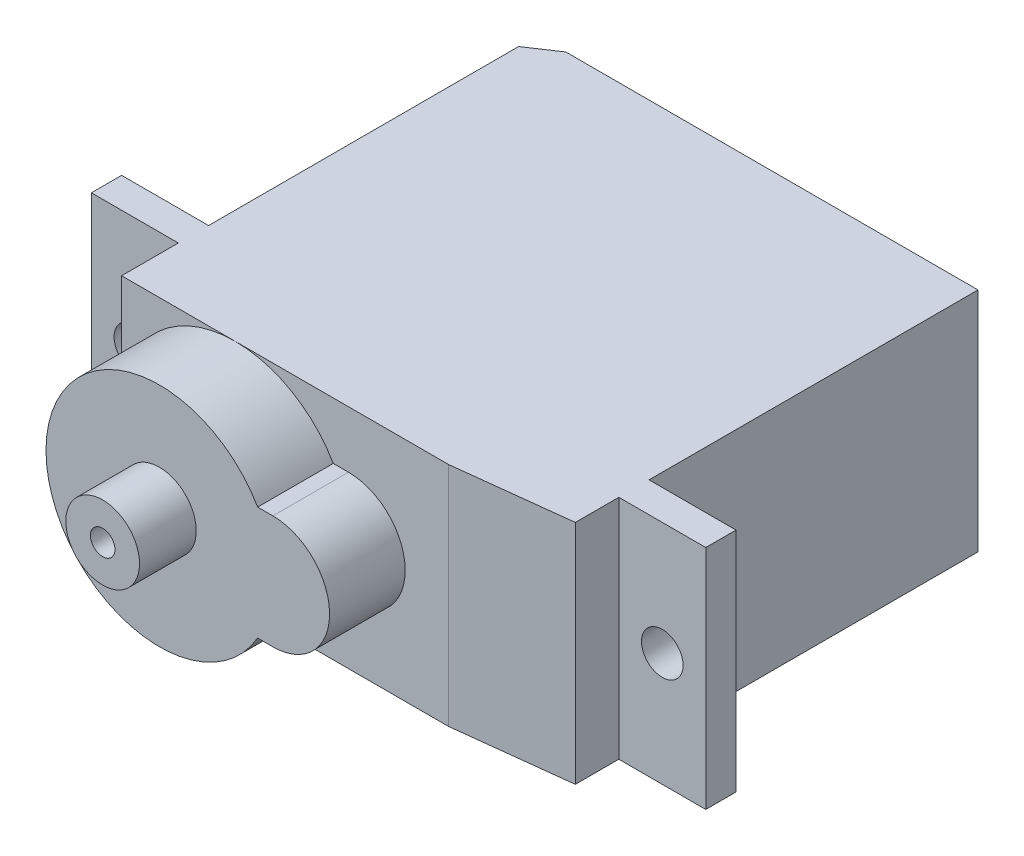
ISO-10303-21;
HEADER;
FILE_DESCRIPTION(('STEP AP214'),'2;1');
FILE_NAME('part.step','',(''),(''),'','','');
FILE_SCHEMA(('AUTOMOTIVE_DESIGN { 1 0 10303 214 1 1 1 1 }'));
ENDSEC;
DATA;
#1=APPLICATION_CONTEXT('core data for automotive mechanical design processes');
#2=APPLICATION_PROTOCOL_DEFINITION('international standard','automotive_design',2000,#1);
#3=PRODUCT_CONTEXT('',#1,'mechanical');
#4=PRODUCT('Part','Part','',(#3));
#5=PRODUCT_RELATED_PRODUCT_CATEGORY('part','',(#4));
#6=PRODUCT_DEFINITION_FORMATION('','',#4);
#7=PRODUCT_DEFINITION_CONTEXT('part definition',#1,'design');
#8=PRODUCT_DEFINITION('design','',#6,#7);
#9=PRODUCT_DEFINITION_SHAPE('','',#8);
#10=(LENGTH_UNIT() NAMED_UNIT(*) SI_UNIT(.MILLI.,.METRE.));
#11=(NAMED_UNIT(*) PLANE_ANGLE_UNIT() SI_UNIT($,.RADIAN.));
#12=(NAMED_UNIT(*) SI_UNIT($,.STERADIAN.) SOLID_ANGLE_UNIT());
#13=UNCERTAINTY_MEASURE_WITH_UNIT(LENGTH_MEASURE(1.E-05),#10,'distance_accuracy_value','');
#14=(GEOMETRIC_REPRESENTATION_CONTEXT(3) GLOBAL_UNCERTAINTY_ASSIGNED_CONTEXT((#13)) GLOBAL_UNIT_ASSIGNED_CONTEXT((#10,
#11,#12)) REPRESENTATION_CONTEXT('',''));
#15=CARTESIAN_POINT('',(0.,0.,0.));
#16=DIRECTION('',(0.,0.,1.));
#17=DIRECTION('',(1.,0.,0.));
#18=AXIS2_PLACEMENT_3D('',#15,#16,#17);
#19=CARTESIAN_POINT('',(7.52282644514605,-5.99999999999992,26.));
#20=DIRECTION('',(0.,0.,1.));
#21=DIRECTION('',(1.,0.,0.));
#22=AXIS2_PLACEMENT_3D('',#19,#20,#21);
#23=PLANE('',#22);
#24=CARTESIAN_POINT('',(5.99715287672404,-5.72034978216512,26.));
#25=DIRECTION('',(0.,0.,1.));
#26=DIRECTION('',(1.,0.,0.));
#27=AXIS2_PLACEMENT_3D('',#24,#25,#26);
#28=CIRCLE('',#27,0.649999999999999);
#29=CARTESIAN_POINT('',(6.64715287672404,-5.72034978216512,26.));
#30=VERTEX_POINT('',#29);
#31=EDGE_CURVE('E18',#30,#30,#28,.T.);
#32=ORIENTED_EDGE('',*,*,#31,.T.);
#33=EDGE_LOOP('',(#32));
#34=FACE_BOUND('',#33,.T.);
#35=ADVANCED_FACE('F15',(#34),#23,.T.);
#36=CARTESIAN_POINT('',(5.99715287672404,-5.72034978216512,26.));
#37=DIRECTION('',(0.,0.,1.));
#38=DIRECTION('',(1.,0.,0.));
#39=AXIS2_PLACEMENT_3D('',#36,#37,#38);
#40=CYLINDRICAL_SURFACE('',#39,0.649999999999999);
#41=ORIENTED_EDGE('',*,*,#31,.F.);
#42=EDGE_LOOP('',(#41));
#43=FACE_BOUND('',#42,.T.);
#44=CARTESIAN_POINT('',(5.99715287672404,-5.72034978216512,29.));
#45=DIRECTION('',(0.,0.,1.));
#46=DIRECTION('',(1.,0.,0.));
#47=AXIS2_PLACEMENT_3D('',#44,#45,#46);
#48=CIRCLE('',#47,0.649999999999999);
#49=CARTESIAN_POINT('',(6.64715287672404,-5.72034978216512,29.));
#50=VERTEX_POINT('',#49);
#51=EDGE_CURVE('E247',#50,#50,#48,.F.);
#52=ORIENTED_EDGE('',*,*,#51,.F.);
#53=EDGE_LOOP('',(#52));
#54=FACE_BOUND('',#53,.T.);
#55=ADVANCED_FACE('F255',(#43,#54),#40,.F.);
#56=CARTESIAN_POINT('',(5.99715287672404,-5.72034978216512,29.));
#57=DIRECTION('',(0.,0.,1.));
#58=DIRECTION('',(1.,0.,0.));
#59=AXIS2_PLACEMENT_3D('',#56,#57,#58);
#60=PLANE('',#59);
#61=CARTESIAN_POINT('',(5.99715287672404,-5.72034978216512,29.));
#62=DIRECTION('',(0.,0.,1.));
#63=DIRECTION('',(1.,0.,0.));
#64=AXIS2_PLACEMENT_3D('',#61,#62,#63);
#65=CIRCLE('',#64,1.95);
#66=CARTESIAN_POINT('',(7.94715287672404,-5.72034978216512,29.));
#67=VERTEX_POINT('',#66);
#68=EDGE_CURVE('E245',#67,#67,#65,.F.);
#69=ORIENTED_EDGE('',*,*,#68,.F.);
#70=EDGE_LOOP('',(#69));
#71=FACE_BOUND('',#70,.T.);
#72=ORIENTED_EDGE('',*,*,#51,.T.);
#73=EDGE_LOOP('',(#72));
#74=FACE_BOUND('',#73,.T.);
#75=ADVANCED_FACE('F258',(#71,#74),#60,.T.);
#76=CARTESIAN_POINT('',(5.99715287672404,-5.72034978216512,26.));
#77=DIRECTION('',(0.,0.,1.));
#78=DIRECTION('',(1.,0.,0.));
#79=AXIS2_PLACEMENT_3D('',#76,#77,#78);
#80=CYLINDRICAL_SURFACE('',#79,1.95);
#81=CARTESIAN_POINT('',(5.99715287672404,-5.72034978216512,26.));
#82=DIRECTION('',(0.,0.,1.));
#83=DIRECTION('',(1.,0.,0.));
#84=AXIS2_PLACEMENT_3D('',#81,#82,#83);
#85=CIRCLE('',#84,1.95);
#86=CARTESIAN_POINT('',(7.94715287672404,-5.72034978216512,26.));
#87=VERTEX_POINT('',#86);
#88=EDGE_CURVE('E241',#87,#87,#85,.F.);
#89=ORIENTED_EDGE('',*,*,#88,.F.);
#90=EDGE_LOOP('',(#89));
#91=FACE_BOUND('',#90,.T.);
#92=ORIENTED_EDGE('',*,*,#68,.T.);
#93=EDGE_LOOP('',(#92));
#94=FACE_BOUND('',#93,.T.);
#95=ADVANCED_FACE('F263',(#91,#94),#80,.T.);
#96=CARTESIAN_POINT('',(-3.5,-6.,0.999999999999998));
#97=DIRECTION('',(-1.,0.,0.));
#98=DIRECTION('',(0.,0.,1.));
#99=AXIS2_PLACEMENT_3D('',#96,#97,#98);
#100=PLANE('',#99);
#101=CARTESIAN_POINT('',(-3.5,-6.,0.999999999999998));
#102=DIRECTION('',(1.,0.,0.));
#103=DIRECTION('',(0.,0.,-1.));
#104=AXIS2_PLACEMENT_3D('',#101,#102,#103);
#105=CIRCLE('',#104,0.5);
#106=CARTESIAN_POINT('',(-3.5,-6.,0.499999999999998));
#107=VERTEX_POINT('',#106);
#108=EDGE_CURVE('E238',#107,#107,#105,.T.);
#109=ORIENTED_EDGE('',*,*,#108,.F.);
#110=EDGE_LOOP('',(#109));
#111=FACE_BOUND('',#110,.T.);
#112=ADVANCED_FACE('F382',(#111),#100,.T.);
#113=CARTESIAN_POINT('',(-3.5,-7.05,0.999999999999994));
#114=DIRECTION('',(-1.,0.,0.));
#115=DIRECTION('',(0.,0.,1.));
#116=AXIS2_PLACEMENT_3D('',#113,#114,#115);
#117=PLANE('',#116);
#118=CARTESIAN_POINT('',(-3.5,-7.05,0.999999999999994));
#119=DIRECTION('',(1.,0.,0.));
#120=DIRECTION('',(0.,0.,-1.));
#121=AXIS2_PLACEMENT_3D('',#118,#119,#120);
#122=CIRCLE('',#121,0.5);
#123=CARTESIAN_POINT('',(-3.5,-7.05,0.499999999999994));
#124=VERTEX_POINT('',#123);
#125=EDGE_CURVE('E234',#124,#124,#122,.T.);
#126=ORIENTED_EDGE('',*,*,#125,.F.);
#127=EDGE_LOOP('',(#126));
#128=FACE_BOUND('',#127,.T.);
#129=ADVANCED_FACE('F378',(#128),#117,.T.);
#130=CARTESIAN_POINT('',(-3.5,-4.95,0.999999999999994));
#131=DIRECTION('',(-1.,0.,0.));
#132=DIRECTION('',(0.,0.,1.));
#133=AXIS2_PLACEMENT_3D('',#130,#131,#132);
#134=PLANE('',#133);
#135=CARTESIAN_POINT('',(-3.5,-4.95,0.999999999999994));
#136=DIRECTION('',(1.,0.,0.));
#137=DIRECTION('',(0.,0.,-1.));
#138=AXIS2_PLACEMENT_3D('',#135,#136,#137);
#139=CIRCLE('',#138,0.5);
#140=CARTESIAN_POINT('',(-3.5,-4.95,0.499999999999994));
#141=VERTEX_POINT('',#140);
#142=EDGE_CURVE('E229',#141,#141,#139,.T.);
#143=ORIENTED_EDGE('',*,*,#142,.F.);
#144=EDGE_LOOP('',(#143));
#145=FACE_BOUND('',#144,.T.);
#146=ADVANCED_FACE('F374',(#145),#134,.T.);
#147=CARTESIAN_POINT('',(7.52282644514605,-5.99999999999992,26.));
#148=DIRECTION('',(0.,0.,1.));
#149=DIRECTION('',(1.,0.,0.));
#150=AXIS2_PLACEMENT_3D('',#147,#148,#149);
#151=PLANE('',#150);
#152=CARTESIAN_POINT('',(12.0000004768372,-6.00000000000003,26.));
#153=DIRECTION('',(0.,0.,1.));
#154=DIRECTION('',(1.,0.,0.));
#155=AXIS2_PLACEMENT_3D('',#152,#153,#154);
#156=CIRCLE('',#155,2.99999999999999);
#157=CARTESIAN_POINT('',(12.0000004768373,-3.00000000000004,26.));
#158=VERTEX_POINT('',#157);
#159=CARTESIAN_POINT('',(12.0000004768372,-9.00000000000002,26.));
#160=VERTEX_POINT('',#159);
#161=EDGE_CURVE('E170',#158,#160,#156,.F.);
#162=ORIENTED_EDGE('',*,*,#161,.F.);
#163=DIRECTION('',(-1.,0.,0.));
#164=VECTOR('',#163,1.);
#165=CARTESIAN_POINT('',(11.5980764497721,-3.00000000000003,26.));
#166=LINE('',#165,#164);
#167=CARTESIAN_POINT('',(11.1961524227068,-3.00000000000002,26.));
#168=VERTEX_POINT('',#167);
#169=EDGE_CURVE('E244',#168,#158,#166,.F.);
#170=ORIENTED_EDGE('',*,*,#169,.F.);
#171=CARTESIAN_POINT('',(6.00000000000009,-5.99999999999988,26.));
#172=DIRECTION('',(0.,0.,1.));
#173=DIRECTION('',(1.,0.,0.));
#174=AXIS2_PLACEMENT_3D('',#171,#172,#173);
#175=CIRCLE('',#174,5.99999999999998);
#176=CARTESIAN_POINT('',(11.1961524227066,-9.00000000000001,26.));
#177=VERTEX_POINT('',#176);
#178=EDGE_CURVE('E222',#177,#168,#175,.F.);
#179=ORIENTED_EDGE('',*,*,#178,.F.);
#180=DIRECTION('',(1.,0.,0.));
#181=VECTOR('',#180,1.);
#182=CARTESIAN_POINT('',(11.5980764497719,-9.00000000000001,26.));
#183=LINE('',#182,#181);
#184=EDGE_CURVE('E163',#160,#177,#183,.F.);
#185=ORIENTED_EDGE('',*,*,#184,.F.);
#186=EDGE_LOOP('',(#162,#170,#179,#185));
#187=FACE_BOUND('',#186,.T.);
#188=ORIENTED_EDGE('',*,*,#88,.T.);
#189=EDGE_LOOP('',(#188));
#190=FACE_BOUND('',#189,.T.);
#191=ADVANCED_FACE('F370',(#187,#190),#151,.T.);
#192=CARTESIAN_POINT('',(11.5980764497721,-3.00000000000003,22.));
#193=DIRECTION('',(0.,1.,0.));
#194=DIRECTION('',(-1.,0.,0.));
#195=AXIS2_PLACEMENT_3D('',#192,#193,#194);
#196=PLANE('',#195);
#197=DIRECTION('',(-1.,0.,0.));
#198=VECTOR('',#197,1.);
#199=CARTESIAN_POINT('',(11.5980764497721,-3.00000000000003,22.));
#200=LINE('',#199,#198);
#201=CARTESIAN_POINT('',(12.0000004768373,-3.00000000000004,22.));
#202=VERTEX_POINT('',#201);
#203=CARTESIAN_POINT('',(11.1961524227068,-3.00000000000002,22.));
#204=VERTEX_POINT('',#203);
#205=EDGE_CURVE('E175',#202,#204,#200,.T.);
#206=ORIENTED_EDGE('',*,*,#205,.T.);
#207=DIRECTION('',(0.,0.,1.));
#208=VECTOR('',#207,1.);
#209=CARTESIAN_POINT('',(11.1961524227068,-3.00000000000003,22.));
#210=LINE('',#209,#208);
#211=EDGE_CURVE('E221',#168,#204,#210,.F.);
#212=ORIENTED_EDGE('',*,*,#211,.F.);
#213=ORIENTED_EDGE('',*,*,#169,.T.);
#214=DIRECTION('',(0.,0.,1.));
#215=VECTOR('',#214,1.);
#216=CARTESIAN_POINT('',(12.0000004768373,-3.00000000000004,22.));
#217=LINE('',#216,#215);
#218=EDGE_CURVE('E171',#202,#158,#217,.T.);
#219=ORIENTED_EDGE('',*,*,#218,.F.);
#220=EDGE_LOOP('',(#206,#212,#213,#219));
#221=FACE_BOUND('',#220,.T.);
#222=ADVANCED_FACE('F367',(#221),#196,.T.);
#223=CARTESIAN_POINT('',(11.5980764497719,-9.00000000000001,22.));
#224=DIRECTION('',(0.,-1.,0.));
#225=DIRECTION('',(1.,0.,0.));
#226=AXIS2_PLACEMENT_3D('',#223,#224,#225);
#227=PLANE('',#226);
#228=DIRECTION('',(1.,0.,0.));
#229=VECTOR('',#228,1.);
#230=CARTESIAN_POINT('',(11.5980764497719,-9.00000000000001,22.));
#231=LINE('',#230,#229);
#232=CARTESIAN_POINT('',(11.1961524227066,-9.00000000000001,22.));
#233=VERTEX_POINT('',#232);
#234=CARTESIAN_POINT('',(12.0000004768372,-9.00000000000002,22.));
#235=VERTEX_POINT('',#234);
#236=EDGE_CURVE('E150',#233,#235,#231,.T.);
#237=ORIENTED_EDGE('',*,*,#236,.T.);
#238=DIRECTION('',(0.,0.,1.));
#239=VECTOR('',#238,1.);
#240=CARTESIAN_POINT('',(12.0000004768372,-9.00000000000002,22.));
#241=LINE('',#240,#239);
#242=EDGE_CURVE('E154',#160,#235,#241,.F.);
#243=ORIENTED_EDGE('',*,*,#242,.F.);
#244=ORIENTED_EDGE('',*,*,#184,.T.);
#245=DIRECTION('',(0.,0.,1.));
#246=VECTOR('',#245,1.);
#247=CARTESIAN_POINT('',(11.1961524227066,-9.00000000000002,22.));
#248=LINE('',#247,#246);
#249=EDGE_CURVE('E157',#233,#177,#248,.T.);
#250=ORIENTED_EDGE('',*,*,#249,.F.);
#251=EDGE_LOOP('',(#237,#243,#244,#250));
#252=FACE_BOUND('',#251,.T.);
#253=ADVANCED_FACE('F152',(#252),#227,.T.);
#254=CARTESIAN_POINT('',(27.9,-6.,17.4));
#255=DIRECTION('',(1.,0.,0.));
#256=DIRECTION('',(0.,0.,-1.));
#257=AXIS2_PLACEMENT_3D('',#254,#255,#256);
#258=PLANE('',#257);
#259=DIRECTION('',(0.,-1.,0.));
#260=VECTOR('',#259,1.);
#261=CARTESIAN_POINT('',(27.9,-5.99999999999999,17.4));
#262=LINE('',#261,#260);
#263=CARTESIAN_POINT('',(27.9,-12.,17.4));
#264=VERTEX_POINT('',#263);
#265=CARTESIAN_POINT('',(27.9,0.,17.4));
#266=VERTEX_POINT('',#265);
#267=EDGE_CURVE('E212',#264,#266,#262,.F.);
#268=ORIENTED_EDGE('',*,*,#267,.T.);
#269=DIRECTION('',(0.,0.,-1.));
#270=VECTOR('',#269,1.);
#271=CARTESIAN_POINT('',(27.9,0.,17.4));
#272=LINE('',#271,#270);
#273=CARTESIAN_POINT('',(27.9,0.,19.));
#274=VERTEX_POINT('',#273);
#275=EDGE_CURVE('E162',#266,#274,#272,.F.);
#276=ORIENTED_EDGE('',*,*,#275,.T.);
#277=DIRECTION('',(0.,-1.,0.));
#278=VECTOR('',#277,1.);
#279=CARTESIAN_POINT('',(27.9,-5.99999999999999,19.));
#280=LINE('',#279,#278);
#281=CARTESIAN_POINT('',(27.9,-12.,19.));
#282=VERTEX_POINT('',#281);
#283=EDGE_CURVE('E217',#282,#274,#280,.F.);
#284=ORIENTED_EDGE('',*,*,#283,.F.);
#285=DIRECTION('',(0.,0.,1.));
#286=VECTOR('',#285,1.);
#287=CARTESIAN_POINT('',(27.9,-12.,0.));
#288=LINE('',#287,#286);
#289=EDGE_CURVE('E640',#264,#282,#288,.T.);
#290=ORIENTED_EDGE('',*,*,#289,.F.);
#291=EDGE_LOOP('',(#268,#276,#284,#290));
#292=FACE_BOUND('',#291,.T.);
#293=ADVANCED_FACE('F360',(#292),#258,.T.);
#294=CARTESIAN_POINT('',(25.6,-6.,17.4));
#295=DIRECTION('',(0.,0.,1.));
#296=DIRECTION('',(1.,0.,0.));
#297=AXIS2_PLACEMENT_3D('',#294,#295,#296);
#298=CYLINDRICAL_SURFACE('',#297,1.1);
#299=CARTESIAN_POINT('',(25.6,-6.,17.4));
#300=DIRECTION('',(0.,0.,1.));
#301=DIRECTION('',(1.,0.,0.));
#302=AXIS2_PLACEMENT_3D('',#299,#300,#301);
#303=CIRCLE('',#302,1.1);
#304=CARTESIAN_POINT('',(26.7,-6.,17.4));
#305=VERTEX_POINT('',#304);
#306=EDGE_CURVE('E208',#305,#305,#303,.F.);
#307=ORIENTED_EDGE('',*,*,#306,.T.);
#308=EDGE_LOOP('',(#307));
#309=FACE_BOUND('',#308,.T.);
#310=CARTESIAN_POINT('',(25.6,-6.,19.));
#311=DIRECTION('',(0.,0.,1.));
#312=DIRECTION('',(1.,0.,0.));
#313=AXIS2_PLACEMENT_3D('',#310,#311,#312);
#314=CIRCLE('',#313,1.1);
#315=CARTESIAN_POINT('',(26.7,-6.,19.));
#316=VERTEX_POINT('',#315);
#317=EDGE_CURVE('E213',#316,#316,#314,.F.);
#318=ORIENTED_EDGE('',*,*,#317,.F.);
#319=EDGE_LOOP('',(#318));
#320=FACE_BOUND('',#319,.T.);
#321=ADVANCED_FACE('F357',(#309,#320),#298,.F.);
#322=CARTESIAN_POINT('',(0.,-6.,0.999999999999998));
#323=DIRECTION('',(1.,0.,0.));
#324=DIRECTION('',(0.,0.,-1.));
#325=AXIS2_PLACEMENT_3D('',#322,#323,#324);
#326=CYLINDRICAL_SURFACE('',#325,0.5);
#327=CARTESIAN_POINT('',(0.,-6.,0.999999999999998));
#328=DIRECTION('',(0.554700196225228,0.,0.832050294337844));
#329=DIRECTION('',(0.832050294337844,0.,-0.554700196225228));
#330=AXIS2_PLACEMENT_3D('',#327,#328,#329);
#331=ELLIPSE('',#330,0.901387818865999,0.5);
#332=CARTESIAN_POINT('',(0.,-5.5,0.999999999999998));
#333=VERTEX_POINT('',#332);
#334=CARTESIAN_POINT('',(0.,-6.5,0.999999999999998));
#335=VERTEX_POINT('',#334);
#336=EDGE_CURVE('E205',#333,#335,#331,.F.);
#337=ORIENTED_EDGE('',*,*,#336,.T.);
#338=CARTESIAN_POINT('',(0.,-6.,0.999999999999998));
#339=DIRECTION('',(1.,0.,0.));
#340=DIRECTION('',(0.,0.,-1.));
#341=AXIS2_PLACEMENT_3D('',#338,#339,#340);
#342=CIRCLE('',#341,0.5);
#343=EDGE_CURVE('E84',#335,#333,#342,.F.);
#344=ORIENTED_EDGE('',*,*,#343,.T.);
#345=EDGE_LOOP('',(#337,#344));
#346=FACE_BOUND('',#345,.T.);
#347=ORIENTED_EDGE('',*,*,#108,.T.);
#348=EDGE_LOOP('',(#347));
#349=FACE_BOUND('',#348,.T.);
#350=ADVANCED_FACE('F353',(#346,#349),#326,.T.);
#351=CARTESIAN_POINT('',(0.,-7.05,0.999999999999994));
#352=DIRECTION('',(1.,0.,0.));
#353=DIRECTION('',(0.,0.,-1.));
#354=AXIS2_PLACEMENT_3D('',#351,#352,#353);
#355=CYLINDRICAL_SURFACE('',#354,0.5);
#356=CARTESIAN_POINT('',(0.,-7.05,0.999999999999994));
#357=DIRECTION('',(0.554700196225228,0.,0.832050294337844));
#358=DIRECTION('',(0.832050294337844,0.,-0.554700196225228));
#359=AXIS2_PLACEMENT_3D('',#356,#357,#358);
#360=ELLIPSE('',#359,0.901387818865999,0.5);
#361=CARTESIAN_POINT('',(0.,-6.55,0.999999999999998));
#362=VERTEX_POINT('',#361);
#363=CARTESIAN_POINT('',(0.,-7.55,0.999999999999998));
#364=VERTEX_POINT('',#363);
#365=EDGE_CURVE('E202',#362,#364,#360,.F.);
#366=ORIENTED_EDGE('',*,*,#365,.T.);
#367=CARTESIAN_POINT('',(0.,-7.05,0.999999999999994));
#368=DIRECTION('',(1.,0.,0.));
#369=DIRECTION('',(0.,0.,-1.));
#370=AXIS2_PLACEMENT_3D('',#367,#368,#369);
#371=CIRCLE('',#370,0.5);
#372=EDGE_CURVE('E232',#364,#362,#371,.F.);
#373=ORIENTED_EDGE('',*,*,#372,.T.);
#374=EDGE_LOOP('',(#366,#373));
#375=FACE_BOUND('',#374,.T.);
#376=ORIENTED_EDGE('',*,*,#125,.T.);
#377=EDGE_LOOP('',(#376));
#378=FACE_BOUND('',#377,.T.);
#379=ADVANCED_FACE('F349',(#375,#378),#355,.T.);
#380=CARTESIAN_POINT('',(0.,-4.95,0.999999999999994));
#381=DIRECTION('',(1.,0.,0.));
#382=DIRECTION('',(0.,0.,-1.));
#383=AXIS2_PLACEMENT_3D('',#380,#381,#382);
#384=CYLINDRICAL_SURFACE('',#383,0.5);
#385=CARTESIAN_POINT('',(0.,-4.95,0.999999999999994));
#386=DIRECTION('',(0.554700196225228,0.,0.832050294337844));
#387=DIRECTION('',(0.832050294337844,0.,-0.554700196225228));
#388=AXIS2_PLACEMENT_3D('',#385,#386,#387);
#389=ELLIPSE('',#388,0.901387818865999,0.5);
#390=CARTESIAN_POINT('',(0.,-4.45,0.999999999999999));
#391=VERTEX_POINT('',#390);
#392=CARTESIAN_POINT('',(0.,-5.45,0.999999999999998));
#393=VERTEX_POINT('',#392);
#394=EDGE_CURVE('E197',#391,#393,#389,.F.);
#395=ORIENTED_EDGE('',*,*,#394,.T.);
#396=CARTESIAN_POINT('',(0.,-4.95,0.999999999999994));
#397=DIRECTION('',(1.,0.,0.));
#398=DIRECTION('',(0.,0.,-1.));
#399=AXIS2_PLACEMENT_3D('',#396,#397,#398);
#400=CIRCLE('',#399,0.5);
#401=EDGE_CURVE('E227',#393,#391,#400,.F.);
#402=ORIENTED_EDGE('',*,*,#401,.T.);
#403=EDGE_LOOP('',(#395,#402));
#404=FACE_BOUND('',#403,.T.);
#405=ORIENTED_EDGE('',*,*,#142,.T.);
#406=EDGE_LOOP('',(#405));
#407=FACE_BOUND('',#406,.T.);
#408=ADVANCED_FACE('F345',(#404,#407),#384,.T.);
#409=CARTESIAN_POINT('',(-2.29999999999998,-5.99999999999999,17.4));
#410=DIRECTION('',(0.,0.,1.));
#411=DIRECTION('',(1.,0.,0.));
#412=AXIS2_PLACEMENT_3D('',#409,#410,#411);
#413=CYLINDRICAL_SURFACE('',#412,1.1);
#414=CARTESIAN_POINT('',(-2.29999999999998,-5.99999999999999,17.4));
#415=DIRECTION('',(0.,0.,1.));
#416=DIRECTION('',(1.,0.,0.));
#417=AXIS2_PLACEMENT_3D('',#414,#415,#416);
#418=CIRCLE('',#417,1.1);
#419=CARTESIAN_POINT('',(-1.19999999999998,-5.99999999999999,17.4));
#420=VERTEX_POINT('',#419);
#421=EDGE_CURVE('E193',#420,#420,#418,.F.);
#422=ORIENTED_EDGE('',*,*,#421,.T.);
#423=EDGE_LOOP('',(#422));
#424=FACE_BOUND('',#423,.T.);
#425=CARTESIAN_POINT('',(-2.29999999999998,-5.99999999999999,19.));
#426=DIRECTION('',(0.,0.,1.));
#427=DIRECTION('',(1.,0.,0.));
#428=AXIS2_PLACEMENT_3D('',#425,#426,#427);
#429=CIRCLE('',#428,1.1);
#430=CARTESIAN_POINT('',(-1.19999999999998,-5.99999999999999,19.));
#431=VERTEX_POINT('',#430);
#432=EDGE_CURVE('E189',#431,#431,#429,.F.);
#433=ORIENTED_EDGE('',*,*,#432,.F.);
#434=EDGE_LOOP('',(#433));
#435=FACE_BOUND('',#434,.T.);
#436=ADVANCED_FACE('F341',(#424,#435),#413,.F.);
#437=CARTESIAN_POINT('',(-4.59999999999998,-5.99999999999999,17.4));
#438=DIRECTION('',(-1.,0.,0.));
#439=DIRECTION('',(0.,-1.,0.));
#440=AXIS2_PLACEMENT_3D('',#437,#438,#439);
#441=PLANE('',#440);
#442=DIRECTION('',(0.,-1.,0.));
#443=VECTOR('',#442,1.);
#444=CARTESIAN_POINT('',(-4.6,-5.99999999999999,17.4));
#445=LINE('',#444,#443);
#446=CARTESIAN_POINT('',(-4.6,0.,17.4));
#447=VERTEX_POINT('',#446);
#448=CARTESIAN_POINT('',(-4.59999999999996,-12.,17.4));
#449=VERTEX_POINT('',#448);
#450=EDGE_CURVE('E749',#447,#449,#445,.T.);
#451=ORIENTED_EDGE('',*,*,#450,.T.);
#452=DIRECTION('',(0.,0.,1.));
#453=VECTOR('',#452,1.);
#454=CARTESIAN_POINT('',(-4.59999999999996,-12.,0.));
#455=LINE('',#454,#453);
#456=CARTESIAN_POINT('',(-4.59999999999999,-12.,19.));
#457=VERTEX_POINT('',#456);
#458=EDGE_CURVE('E658',#457,#449,#455,.F.);
#459=ORIENTED_EDGE('',*,*,#458,.F.);
#460=DIRECTION('',(0.,-1.,0.));
#461=VECTOR('',#460,1.);
#462=CARTESIAN_POINT('',(-4.6,-5.99999999999999,19.));
#463=LINE('',#462,#461);
#464=CARTESIAN_POINT('',(-4.6,0.,19.));
#465=VERTEX_POINT('',#464);
#466=EDGE_CURVE('E192',#465,#457,#463,.T.);
#467=ORIENTED_EDGE('',*,*,#466,.F.);
#468=DIRECTION('',(0.,0.,1.));
#469=VECTOR('',#468,1.);
#470=CARTESIAN_POINT('',(-4.6,0.,17.4));
#471=LINE('',#470,#469);
#472=EDGE_CURVE('E226',#465,#447,#471,.F.);
#473=ORIENTED_EDGE('',*,*,#472,.T.);
#474=EDGE_LOOP('',(#451,#459,#467,#473));
#475=FACE_BOUND('',#474,.T.);
#476=ADVANCED_FACE('F337',(#475),#441,.T.);
#477=CARTESIAN_POINT('',(11.65,-6.,22.));
#478=DIRECTION('',(0.,0.,1.));
#479=DIRECTION('',(1.,0.,0.));
#480=AXIS2_PLACEMENT_3D('',#477,#478,#479);
#481=PLANE('',#480);
#482=DIRECTION('',(0.,1.,0.));
#483=VECTOR('',#482,1.);
#484=CARTESIAN_POINT('',(0.,-6.,22.));
#485=LINE('',#484,#483);
#486=CARTESIAN_POINT('',(0.,-12.,22.));
#487=VERTEX_POINT('',#486);
#488=CARTESIAN_POINT('',(0.,-5.99999999999988,22.));
#489=VERTEX_POINT('',#488);
#490=EDGE_CURVE('E643',#487,#489,#485,.T.);
#491=ORIENTED_EDGE('',*,*,#490,.F.);
#492=DIRECTION('',(1.,0.,0.));
#493=VECTOR('',#492,1.);
#494=CARTESIAN_POINT('',(11.65,-12.,22.));
#495=LINE('',#494,#493);
#496=CARTESIAN_POINT('',(6.00000000000009,-11.9999999999999,22.));
#497=VERTEX_POINT('',#496);
#498=EDGE_CURVE('E661',#497,#487,#495,.F.);
#499=ORIENTED_EDGE('',*,*,#498,.F.);
#500=CARTESIAN_POINT('',(6.00000000000009,-5.99999999999988,22.));
#501=DIRECTION('',(0.,0.,1.));
#502=DIRECTION('',(1.,0.,0.));
#503=AXIS2_PLACEMENT_3D('',#500,#501,#502);
#504=CIRCLE('',#503,5.99999999999998);
#505=EDGE_CURVE('E218',#489,#497,#504,.T.);
#506=ORIENTED_EDGE('',*,*,#505,.F.);
#507=EDGE_LOOP('',(#491,#499,#506));
#508=FACE_BOUND('',#507,.T.);
#509=ADVANCED_FACE('F334',(#508),#481,.T.);
#510=CARTESIAN_POINT('',(12.0000004768372,-6.00000000000003,22.));
#511=DIRECTION('',(0.,0.,1.));
#512=DIRECTION('',(1.,0.,0.));
#513=AXIS2_PLACEMENT_3D('',#510,#511,#512);
#514=CYLINDRICAL_SURFACE('',#513,2.99999999999999);
#515=CARTESIAN_POINT('',(12.0000004768372,-6.00000000000003,22.));
#516=DIRECTION('',(0.,0.,1.));
#517=DIRECTION('',(1.,0.,0.));
#518=AXIS2_PLACEMENT_3D('',#515,#516,#517);
#519=CIRCLE('',#518,2.99999999999999);
#520=EDGE_CURVE('E169',#202,#235,#519,.F.);
#521=ORIENTED_EDGE('',*,*,#520,.F.);
#522=ORIENTED_EDGE('',*,*,#218,.T.);
#523=ORIENTED_EDGE('',*,*,#161,.T.);
#524=ORIENTED_EDGE('',*,*,#242,.T.);
#525=EDGE_LOOP('',(#521,#522,#523,#524));
#526=FACE_BOUND('',#525,.T.);
#527=ADVANCED_FACE('F167',(#526),#514,.T.);
#528=CARTESIAN_POINT('',(6.00000000000009,-5.99999999999988,22.));
#529=DIRECTION('',(0.,0.,1.));
#530=DIRECTION('',(1.,0.,0.));
#531=AXIS2_PLACEMENT_3D('',#528,#529,#530);
#532=CYLINDRICAL_SURFACE('',#531,5.99999999999998);
#533=CARTESIAN_POINT('',(6.00000000000009,-5.99999999999988,22.));
#534=DIRECTION('',(0.,0.,1.));
#535=DIRECTION('',(1.,0.,0.));
#536=AXIS2_PLACEMENT_3D('',#533,#534,#535);
#537=CIRCLE('',#536,5.99999999999998);
#538=EDGE_CURVE('E177',#233,#497,#537,.F.);
#539=ORIENTED_EDGE('',*,*,#538,.F.);
#540=ORIENTED_EDGE('',*,*,#249,.T.);
#541=ORIENTED_EDGE('',*,*,#178,.T.);
#542=ORIENTED_EDGE('',*,*,#211,.T.);
#543=CARTESIAN_POINT('',(6.00000000000009,-5.99999999999988,22.));
#544=DIRECTION('',(0.,0.,1.));
#545=DIRECTION('',(1.,0.,0.));
#546=AXIS2_PLACEMENT_3D('',#543,#544,#545);
#547=CIRCLE('',#546,5.99999999999998);
#548=CARTESIAN_POINT('',(6.00000000000009,0.,22.));
#549=VERTEX_POINT('',#548);
#550=EDGE_CURVE('E33',#549,#204,#547,.F.);
#551=ORIENTED_EDGE('',*,*,#550,.F.);
#552=CARTESIAN_POINT('',(6.00000000000009,-5.99999999999988,22.));
#553=DIRECTION('',(0.,0.,1.));
#554=DIRECTION('',(1.,0.,0.));
#555=AXIS2_PLACEMENT_3D('',#552,#553,#554);
#556=CIRCLE('',#555,5.99999999999998);
#557=EDGE_CURVE('E185',#489,#549,#556,.F.);
#558=ORIENTED_EDGE('',*,*,#557,.F.);
#559=ORIENTED_EDGE('',*,*,#505,.T.);
#560=EDGE_LOOP('',(#539,#540,#541,#542,#551,#558,#559));
#561=FACE_BOUND('',#560,.T.);
#562=ADVANCED_FACE('F329',(#561),#532,.T.);
#563=CARTESIAN_POINT('',(11.65,-12.,0.));
#564=DIRECTION('',(0.,-1.,0.));
#565=DIRECTION('',(1.,0.,0.));
#566=AXIS2_PLACEMENT_3D('',#563,#564,#565);
#567=PLANE('',#566);
#568=DIRECTION('',(1.,0.,0.));
#569=VECTOR('',#568,1.);
#570=CARTESIAN_POINT('',(11.65,-12.,19.));
#571=LINE('',#570,#569);
#572=CARTESIAN_POINT('',(23.3,-12.,19.));
#573=VERTEX_POINT('',#572);
#574=EDGE_CURVE('E742',#573,#282,#571,.T.);
#575=ORIENTED_EDGE('',*,*,#574,.F.);
#576=DIRECTION('',(0.,0.,-1.));
#577=VECTOR('',#576,1.);
#578=CARTESIAN_POINT('',(23.3,-12.,19.));
#579=LINE('',#578,#577);
#580=CARTESIAN_POINT('',(23.3,-12.,21.3));
#581=VERTEX_POINT('',#580);
#582=EDGE_CURVE('E734',#581,#573,#579,.T.);
#583=ORIENTED_EDGE('',*,*,#582,.F.);
#584=DIRECTION('',(-0.993263139087243,0.,0.115880699560178));
#585=VECTOR('',#584,1.);
#586=CARTESIAN_POINT('',(20.3,-12.,21.65));
#587=LINE('',#586,#585);
#588=CARTESIAN_POINT('',(17.3,-12.,22.));
#589=VERTEX_POINT('',#588);
#590=EDGE_CURVE('E637',#581,#589,#587,.T.);
#591=ORIENTED_EDGE('',*,*,#590,.T.);
#592=DIRECTION('',(1.,0.,0.));
#593=VECTOR('',#592,1.);
#594=CARTESIAN_POINT('',(11.65,-12.,22.));
#595=LINE('',#594,#593);
#596=EDGE_CURVE('E179',#497,#589,#595,.T.);
#597=ORIENTED_EDGE('',*,*,#596,.F.);
#598=ORIENTED_EDGE('',*,*,#498,.T.);
#599=DIRECTION('',(0.,0.,1.));
#600=VECTOR('',#599,1.);
#601=CARTESIAN_POINT('',(0.,-12.,19.));
#602=LINE('',#601,#600);
#603=CARTESIAN_POINT('',(0.,-12.,19.));
#604=VERTEX_POINT('',#603);
#605=EDGE_CURVE('E188',#604,#487,#602,.T.);
#606=ORIENTED_EDGE('',*,*,#605,.F.);
#607=DIRECTION('',(1.,0.,0.));
#608=VECTOR('',#607,1.);
#609=CARTESIAN_POINT('',(11.65,-12.,19.));
#610=LINE('',#609,#608);
#611=EDGE_CURVE('E647',#457,#604,#610,.T.);
#612=ORIENTED_EDGE('',*,*,#611,.F.);
#613=ORIENTED_EDGE('',*,*,#458,.T.);
#614=DIRECTION('',(1.,0.,0.));
#615=VECTOR('',#614,1.);
#616=CARTESIAN_POINT('',(11.65,-12.,17.4));
#617=LINE('',#616,#615);
#618=CARTESIAN_POINT('',(0.,-12.,17.4));
#619=VERTEX_POINT('',#618);
#620=EDGE_CURVE('E751',#449,#619,#617,.T.);
#621=ORIENTED_EDGE('',*,*,#620,.T.);
#622=DIRECTION('',(0.,0.,1.));
#623=VECTOR('',#622,1.);
#624=CARTESIAN_POINT('',(0.,-12.,0.));
#625=LINE('',#624,#623);
#626=CARTESIAN_POINT('',(0.,-12.,0.999999999999998));
#627=VERTEX_POINT('',#626);
#628=EDGE_CURVE('E682',#627,#619,#625,.T.);
#629=ORIENTED_EDGE('',*,*,#628,.F.);
#630=DIRECTION('',(0.832050294337844,0.,-0.554700196225228));
#631=VECTOR('',#630,1.);
#632=CARTESIAN_POINT('',(0.749999999999999,-12.,0.5));
#633=LINE('',#632,#631);
#634=CARTESIAN_POINT('',(1.5,-12.,0.));
#635=VERTEX_POINT('',#634);
#636=EDGE_CURVE('E96',#627,#635,#633,.T.);
#637=ORIENTED_EDGE('',*,*,#636,.T.);
#638=DIRECTION('',(1.,0.,0.));
#639=VECTOR('',#638,1.);
#640=CARTESIAN_POINT('',(11.65,-12.,0.));
#641=LINE('',#640,#639);
#642=CARTESIAN_POINT('',(23.3,-12.,0.));
#643=VERTEX_POINT('',#642);
#644=EDGE_CURVE('E689',#635,#643,#641,.T.);
#645=ORIENTED_EDGE('',*,*,#644,.T.);
#646=DIRECTION('',(0.,0.,-1.));
#647=VECTOR('',#646,1.);
#648=CARTESIAN_POINT('',(23.3,-12.,0.));
#649=LINE('',#648,#647);
#650=CARTESIAN_POINT('',(23.3,-12.,17.4));
#651=VERTEX_POINT('',#650);
#652=EDGE_CURVE('E691',#651,#643,#649,.T.);
#653=ORIENTED_EDGE('',*,*,#652,.F.);
#654=DIRECTION('',(1.,0.,0.));
#655=VECTOR('',#654,1.);
#656=CARTESIAN_POINT('',(11.65,-12.,17.4));
#657=LINE('',#656,#655);
#658=EDGE_CURVE('E216',#651,#264,#657,.T.);
#659=ORIENTED_EDGE('',*,*,#658,.T.);
#660=ORIENTED_EDGE('',*,*,#289,.T.);
#661=EDGE_LOOP('',(#575,#583,#591,#597,#598,#606,#612,#613,#621,#629,#637,#645,#653,#659,#660));
#662=FACE_BOUND('',#661,.T.);
#663=ADVANCED_FACE('F325',(#662),#567,.T.);
#664=CARTESIAN_POINT('',(20.3,-12.,21.65));
#665=DIRECTION('',(-0.115880699560178,0.,-0.993263139087243));
#666=DIRECTION('',(-0.993263139087243,0.,0.115880699560178));
#667=AXIS2_PLACEMENT_3D('',#664,#665,#666);
#668=PLANE('',#667);
#669=DIRECTION('',(0.,1.,0.));
#670=VECTOR('',#669,1.);
#671=CARTESIAN_POINT('',(17.3,-6.,22.));
#672=LINE('',#671,#670);
#673=CARTESIAN_POINT('',(17.3,0.,22.));
#674=VERTEX_POINT('',#673);
#675=EDGE_CURVE('E181',#589,#674,#672,.T.);
#676=ORIENTED_EDGE('',*,*,#675,.F.);
#677=ORIENTED_EDGE('',*,*,#590,.F.);
#678=DIRECTION('',(0.,1.,0.));
#679=VECTOR('',#678,1.);
#680=CARTESIAN_POINT('',(23.3,-6.,21.3));
#681=LINE('',#680,#679);
#682=CARTESIAN_POINT('',(23.3,0.,21.3));
#683=VERTEX_POINT('',#682);
#684=EDGE_CURVE('E639',#683,#581,#681,.F.);
#685=ORIENTED_EDGE('',*,*,#684,.F.);
#686=DIRECTION('',(0.993263139087243,0.,-0.115880699560179));
#687=VECTOR('',#686,1.);
#688=CARTESIAN_POINT('',(17.3,0.,22.));
#689=LINE('',#688,#687);
#690=EDGE_CURVE('E798',#674,#683,#689,.T.);
#691=ORIENTED_EDGE('',*,*,#690,.F.);
#692=EDGE_LOOP('',(#676,#677,#685,#691));
#693=FACE_BOUND('',#692,.T.);
#694=ADVANCED_FACE('F321',(#693),#668,.F.);
#695=CARTESIAN_POINT('',(23.3,-6.,19.));
#696=DIRECTION('',(1.,0.,0.));
#697=DIRECTION('',(0.,0.,-1.));
#698=AXIS2_PLACEMENT_3D('',#695,#696,#697);
#699=PLANE('',#698);
#700=DIRECTION('',(0.,-1.,0.));
#701=VECTOR('',#700,1.);
#702=CARTESIAN_POINT('',(23.3,-5.99999999999999,19.));
#703=LINE('',#702,#701);
#704=CARTESIAN_POINT('',(23.3,0.,19.));
#705=VERTEX_POINT('',#704);
#706=EDGE_CURVE('E737',#705,#573,#703,.T.);
#707=ORIENTED_EDGE('',*,*,#706,.F.);
#708=DIRECTION('',(0.,0.,1.));
#709=VECTOR('',#708,1.);
#710=CARTESIAN_POINT('',(23.3,0.,0.));
#711=LINE('',#710,#709);
#712=EDGE_CURVE('E795',#683,#705,#711,.F.);
#713=ORIENTED_EDGE('',*,*,#712,.F.);
#714=ORIENTED_EDGE('',*,*,#684,.T.);
#715=ORIENTED_EDGE('',*,*,#582,.T.);
#716=EDGE_LOOP('',(#707,#713,#714,#715));
#717=FACE_BOUND('',#716,.T.);
#718=ADVANCED_FACE('F317',(#717),#699,.T.);
#719=CARTESIAN_POINT('',(11.65,-5.99999999999999,19.));
#720=DIRECTION('',(0.,0.,1.));
#721=DIRECTION('',(0.,-1.,0.));
#722=AXIS2_PLACEMENT_3D('',#719,#720,#721);
#723=PLANE('',#722);
#724=ORIENTED_EDGE('',*,*,#317,.T.);
#725=EDGE_LOOP('',(#724));
#726=FACE_BOUND('',#725,.T.);
#727=ORIENTED_EDGE('',*,*,#283,.T.);
#728=DIRECTION('',(1.,0.,0.));
#729=VECTOR('',#728,1.);
#730=CARTESIAN_POINT('',(11.65,0.,19.));
#731=LINE('',#730,#729);
#732=EDGE_CURVE('E722',#705,#274,#731,.T.);
#733=ORIENTED_EDGE('',*,*,#732,.F.);
#734=ORIENTED_EDGE('',*,*,#706,.T.);
#735=ORIENTED_EDGE('',*,*,#574,.T.);
#736=EDGE_LOOP('',(#727,#733,#734,#735));
#737=FACE_BOUND('',#736,.T.);
#738=ADVANCED_FACE('F313',(#726,#737),#723,.T.);
#739=CARTESIAN_POINT('',(11.65,-5.99999999999999,17.4));
#740=DIRECTION('',(0.,0.,1.));
#741=DIRECTION('',(0.,-1.,0.));
#742=AXIS2_PLACEMENT_3D('',#739,#740,#741);
#743=PLANE('',#742);
#744=ORIENTED_EDGE('',*,*,#306,.F.);
#745=EDGE_LOOP('',(#744));
#746=FACE_BOUND('',#745,.T.);
#747=DIRECTION('',(1.,0.,0.));
#748=VECTOR('',#747,1.);
#749=CARTESIAN_POINT('',(11.65,0.,17.4));
#750=LINE('',#749,#748);
#751=CARTESIAN_POINT('',(23.3,0.,17.4));
#752=VERTEX_POINT('',#751);
#753=EDGE_CURVE('E717',#266,#752,#750,.F.);
#754=ORIENTED_EDGE('',*,*,#753,.F.);
#755=ORIENTED_EDGE('',*,*,#267,.F.);
#756=ORIENTED_EDGE('',*,*,#658,.F.);
#757=DIRECTION('',(0.,1.,0.));
#758=VECTOR('',#757,1.);
#759=CARTESIAN_POINT('',(23.3,-6.,17.4));
#760=LINE('',#759,#758);
#761=EDGE_CURVE('E211',#752,#651,#760,.F.);
#762=ORIENTED_EDGE('',*,*,#761,.F.);
#763=EDGE_LOOP('',(#754,#755,#756,#762));
#764=FACE_BOUND('',#763,.T.);
#765=ADVANCED_FACE('F309',(#746,#764),#743,.F.);
#766=CARTESIAN_POINT('',(23.3,-6.,0.));
#767=DIRECTION('',(1.,0.,0.));
#768=DIRECTION('',(0.,0.,-1.));
#769=AXIS2_PLACEMENT_3D('',#766,#767,#768);
#770=PLANE('',#769);
#771=DIRECTION('',(0.,1.,0.));
#772=VECTOR('',#771,1.);
#773=CARTESIAN_POINT('',(23.3,-6.,0.));
#774=LINE('',#773,#772);
#775=CARTESIAN_POINT('',(23.3,0.,0.));
#776=VERTEX_POINT('',#775);
#777=EDGE_CURVE('E207',#643,#776,#774,.T.);
#778=ORIENTED_EDGE('',*,*,#777,.T.);
#779=DIRECTION('',(0.,0.,1.));
#780=VECTOR('',#779,1.);
#781=CARTESIAN_POINT('',(23.3,0.,0.));
#782=LINE('',#781,#780);
#783=EDGE_CURVE('E714',#752,#776,#782,.F.);
#784=ORIENTED_EDGE('',*,*,#783,.F.);
#785=ORIENTED_EDGE('',*,*,#761,.T.);
#786=ORIENTED_EDGE('',*,*,#652,.T.);
#787=EDGE_LOOP('',(#778,#784,#785,#786));
#788=FACE_BOUND('',#787,.T.);
#789=ADVANCED_FACE('F305',(#788),#770,.T.);
#790=CARTESIAN_POINT('',(11.65,-6.,0.));
#791=DIRECTION('',(0.,0.,1.));
#792=DIRECTION('',(1.,0.,0.));
#793=AXIS2_PLACEMENT_3D('',#790,#791,#792);
#794=PLANE('',#793);
#795=DIRECTION('',(1.,0.,0.));
#796=VECTOR('',#795,1.);
#797=CARTESIAN_POINT('',(11.65,0.,0.));
#798=LINE('',#797,#796);
#799=CARTESIAN_POINT('',(1.5,0.,0.));
#800=VERTEX_POINT('',#799);
#801=EDGE_CURVE('E676',#776,#800,#798,.F.);
#802=ORIENTED_EDGE('',*,*,#801,.F.);
#803=ORIENTED_EDGE('',*,*,#777,.F.);
#804=ORIENTED_EDGE('',*,*,#644,.F.);
#805=DIRECTION('',(0.,1.,0.));
#806=VECTOR('',#805,1.);
#807=CARTESIAN_POINT('',(1.5,-12.,0.));
#808=LINE('',#807,#806);
#809=EDGE_CURVE('E201',#635,#800,#808,.T.);
#810=ORIENTED_EDGE('',*,*,#809,.T.);
#811=EDGE_LOOP('',(#802,#803,#804,#810));
#812=FACE_BOUND('',#811,.T.);
#813=ADVANCED_FACE('F301',(#812),#794,.F.);
#814=CARTESIAN_POINT('',(0.749999999999999,-12.,0.5));
#815=DIRECTION('',(0.554700196225228,0.,0.832050294337844));
#816=DIRECTION('',(0.832050294337844,0.,-0.554700196225228));
#817=AXIS2_PLACEMENT_3D('',#814,#815,#816);
#818=PLANE('',#817);
#819=DIRECTION('',(0.,1.,0.));
#820=VECTOR('',#819,1.);
#821=CARTESIAN_POINT('',(0.,-6.,1.));
#822=LINE('',#821,#820);
#823=CARTESIAN_POINT('',(0.,0.,1.));
#824=VERTEX_POINT('',#823);
#825=EDGE_CURVE('E685',#824,#391,#822,.F.);
#826=ORIENTED_EDGE('',*,*,#825,.F.);
#827=DIRECTION('',(-0.832050294337844,0.,0.554700196225228));
#828=VECTOR('',#827,1.);
#829=CARTESIAN_POINT('',(1.5,0.,0.));
#830=LINE('',#829,#828);
#831=EDGE_CURVE('E671',#800,#824,#830,.T.);
#832=ORIENTED_EDGE('',*,*,#831,.F.);
#833=ORIENTED_EDGE('',*,*,#809,.F.);
#834=ORIENTED_EDGE('',*,*,#636,.F.);
#835=DIRECTION('',(0.,1.,0.));
#836=VECTOR('',#835,1.);
#837=CARTESIAN_POINT('',(0.,-6.,0.999999999999998));
#838=LINE('',#837,#836);
#839=EDGE_CURVE('E686',#364,#627,#838,.F.);
#840=ORIENTED_EDGE('',*,*,#839,.F.);
#841=ORIENTED_EDGE('',*,*,#365,.F.);
#842=DIRECTION('',(0.,1.,0.));
#843=VECTOR('',#842,1.);
#844=CARTESIAN_POINT('',(0.,-6.,0.999999999999998));
#845=LINE('',#844,#843);
#846=EDGE_CURVE('E200',#335,#362,#845,.F.);
#847=ORIENTED_EDGE('',*,*,#846,.F.);
#848=ORIENTED_EDGE('',*,*,#336,.F.);
#849=DIRECTION('',(0.,1.,0.));
#850=VECTOR('',#849,1.);
#851=CARTESIAN_POINT('',(0.,-6.,0.999999999999998));
#852=LINE('',#851,#850);
#853=EDGE_CURVE('E752',#393,#333,#852,.F.);
#854=ORIENTED_EDGE('',*,*,#853,.F.);
#855=ORIENTED_EDGE('',*,*,#394,.F.);
#856=EDGE_LOOP('',(#826,#832,#833,#834,#840,#841,#847,#848,#854,#855));
#857=FACE_BOUND('',#856,.T.);
#858=ADVANCED_FACE('F298',(#857),#818,.F.);
#859=CARTESIAN_POINT('',(0.,-6.,0.));
#860=DIRECTION('',(-1.,0.,0.));
#861=DIRECTION('',(0.,0.,1.));
#862=AXIS2_PLACEMENT_3D('',#859,#860,#861);
#863=PLANE('',#862);
#864=ORIENTED_EDGE('',*,*,#401,.F.);
#865=ORIENTED_EDGE('',*,*,#853,.T.);
#866=ORIENTED_EDGE('',*,*,#343,.F.);
#867=ORIENTED_EDGE('',*,*,#846,.T.);
#868=ORIENTED_EDGE('',*,*,#372,.F.);
#869=ORIENTED_EDGE('',*,*,#839,.T.);
#870=ORIENTED_EDGE('',*,*,#628,.T.);
#871=DIRECTION('',(0.,-1.,0.));
#872=VECTOR('',#871,1.);
#873=CARTESIAN_POINT('',(0.,-5.99999999999999,17.4));
#874=LINE('',#873,#872);
#875=CARTESIAN_POINT('',(0.,0.,17.4));
#876=VERTEX_POINT('',#875);
#877=EDGE_CURVE('E196',#619,#876,#874,.F.);
#878=ORIENTED_EDGE('',*,*,#877,.T.);
#879=DIRECTION('',(0.,0.,1.));
#880=VECTOR('',#879,1.);
#881=CARTESIAN_POINT('',(0.,0.,0.));
#882=LINE('',#881,#880);
#883=EDGE_CURVE('E667',#824,#876,#882,.T.);
#884=ORIENTED_EDGE('',*,*,#883,.F.);
#885=ORIENTED_EDGE('',*,*,#825,.T.);
#886=EDGE_LOOP('',(#864,#865,#866,#867,#868,#869,#870,#878,#884,#885));
#887=FACE_BOUND('',#886,.T.);
#888=ADVANCED_FACE('F294',(#887),#863,.T.);
#889=CARTESIAN_POINT('',(11.65,-5.99999999999999,17.4));
#890=DIRECTION('',(0.,0.,1.));
#891=DIRECTION('',(0.,-1.,0.));
#892=AXIS2_PLACEMENT_3D('',#889,#890,#891);
#893=PLANE('',#892);
#894=ORIENTED_EDGE('',*,*,#421,.F.);
#895=EDGE_LOOP('',(#894));
#896=FACE_BOUND('',#895,.T.);
#897=ORIENTED_EDGE('',*,*,#620,.F.);
#898=ORIENTED_EDGE('',*,*,#450,.F.);
#899=DIRECTION('',(1.,0.,0.));
#900=VECTOR('',#899,1.);
#901=CARTESIAN_POINT('',(11.65,0.,17.4));
#902=LINE('',#901,#900);
#903=EDGE_CURVE('E670',#876,#447,#902,.F.);
#904=ORIENTED_EDGE('',*,*,#903,.F.);
#905=ORIENTED_EDGE('',*,*,#877,.F.);
#906=EDGE_LOOP('',(#897,#898,#904,#905));
#907=FACE_BOUND('',#906,.T.);
#908=ADVANCED_FACE('F290',(#896,#907),#893,.F.);
#909=CARTESIAN_POINT('',(11.65,-5.99999999999999,19.));
#910=DIRECTION('',(0.,0.,1.));
#911=DIRECTION('',(0.,-1.,0.));
#912=AXIS2_PLACEMENT_3D('',#909,#910,#911);
#913=PLANE('',#912);
#914=ORIENTED_EDGE('',*,*,#466,.T.);
#915=ORIENTED_EDGE('',*,*,#611,.T.);
#916=DIRECTION('',(0.,1.,0.));
#917=VECTOR('',#916,1.);
#918=CARTESIAN_POINT('',(0.,-6.,19.));
#919=LINE('',#918,#917);
#920=CARTESIAN_POINT('',(0.,0.,19.));
#921=VERTEX_POINT('',#920);
#922=EDGE_CURVE('E646',#921,#604,#919,.F.);
#923=ORIENTED_EDGE('',*,*,#922,.F.);
#924=DIRECTION('',(1.,0.,0.));
#925=VECTOR('',#924,1.);
#926=CARTESIAN_POINT('',(11.65,0.,19.));
#927=LINE('',#926,#925);
#928=EDGE_CURVE('E762',#465,#921,#927,.T.);
#929=ORIENTED_EDGE('',*,*,#928,.F.);
#930=EDGE_LOOP('',(#914,#915,#923,#929));
#931=FACE_BOUND('',#930,.T.);
#932=ORIENTED_EDGE('',*,*,#432,.T.);
#933=EDGE_LOOP('',(#932));
#934=FACE_BOUND('',#933,.T.);
#935=ADVANCED_FACE('F286',(#931,#934),#913,.T.);
#936=CARTESIAN_POINT('',(0.,-6.,19.));
#937=DIRECTION('',(-1.,0.,0.));
#938=DIRECTION('',(0.,0.,1.));
#939=AXIS2_PLACEMENT_3D('',#936,#937,#938);
#940=PLANE('',#939);
#941=ORIENTED_EDGE('',*,*,#922,.T.);
#942=ORIENTED_EDGE('',*,*,#605,.T.);
#943=ORIENTED_EDGE('',*,*,#490,.T.);
#944=DIRECTION('',(0.,1.,0.));
#945=VECTOR('',#944,1.);
#946=CARTESIAN_POINT('',(0.,-6.,22.));
#947=LINE('',#946,#945);
#948=CARTESIAN_POINT('',(0.,0.,22.));
#949=VERTEX_POINT('',#948);
#950=EDGE_CURVE('E187',#949,#489,#947,.F.);
#951=ORIENTED_EDGE('',*,*,#950,.F.);
#952=DIRECTION('',(0.,0.,1.));
#953=VECTOR('',#952,1.);
#954=CARTESIAN_POINT('',(0.,0.,0.));
#955=LINE('',#954,#953);
#956=EDGE_CURVE('E766',#921,#949,#955,.T.);
#957=ORIENTED_EDGE('',*,*,#956,.F.);
#958=EDGE_LOOP('',(#941,#942,#943,#951,#957));
#959=FACE_BOUND('',#958,.T.);
#960=ADVANCED_FACE('F282',(#959),#940,.T.);
#961=CARTESIAN_POINT('',(11.65,-6.,22.));
#962=DIRECTION('',(0.,0.,1.));
#963=DIRECTION('',(1.,0.,0.));
#964=AXIS2_PLACEMENT_3D('',#961,#962,#963);
#965=PLANE('',#964);
#966=DIRECTION('',(1.,0.,0.));
#967=VECTOR('',#966,1.);
#968=CARTESIAN_POINT('',(11.65,0.,22.));
#969=LINE('',#968,#967);
#970=EDGE_CURVE('E24',#949,#549,#969,.T.);
#971=ORIENTED_EDGE('',*,*,#970,.F.);
#972=ORIENTED_EDGE('',*,*,#950,.T.);
#973=ORIENTED_EDGE('',*,*,#557,.T.);
#974=EDGE_LOOP('',(#971,#972,#973));
#975=FACE_BOUND('',#974,.T.);
#976=ADVANCED_FACE('F276',(#975),#965,.T.);
#977=CARTESIAN_POINT('',(11.65,-6.,22.));
#978=DIRECTION('',(0.,0.,1.));
#979=DIRECTION('',(1.,0.,0.));
#980=AXIS2_PLACEMENT_3D('',#977,#978,#979);
#981=PLANE('',#980);
#982=ORIENTED_EDGE('',*,*,#538,.T.);
#983=ORIENTED_EDGE('',*,*,#596,.T.);
#984=ORIENTED_EDGE('',*,*,#675,.T.);
#985=DIRECTION('',(1.,0.,0.));
#986=VECTOR('',#985,1.);
#987=CARTESIAN_POINT('',(11.65,0.,22.));
#988=LINE('',#987,#986);
#989=EDGE_CURVE('E9',#549,#674,#988,.T.);
#990=ORIENTED_EDGE('',*,*,#989,.F.);
#991=ORIENTED_EDGE('',*,*,#550,.T.);
#992=ORIENTED_EDGE('',*,*,#205,.F.);
#993=ORIENTED_EDGE('',*,*,#520,.T.);
#994=ORIENTED_EDGE('',*,*,#236,.F.);
#995=EDGE_LOOP('',(#982,#983,#984,#990,#991,#992,#993,#994));
#996=FACE_BOUND('',#995,.T.);
#997=ADVANCED_FACE('F173',(#996),#981,.T.);
#998=CARTESIAN_POINT('',(11.65,0.,0.));
#999=DIRECTION('',(0.,1.,0.));
#1000=DIRECTION('',(0.,0.,1.));
#1001=AXIS2_PLACEMENT_3D('',#998,#999,#1000);
#1002=PLANE('',#1001);
#1003=ORIENTED_EDGE('',*,*,#970,.T.);
#1004=ORIENTED_EDGE('',*,*,#989,.T.);
#1005=ORIENTED_EDGE('',*,*,#690,.T.);
#1006=ORIENTED_EDGE('',*,*,#712,.T.);
#1007=ORIENTED_EDGE('',*,*,#732,.T.);
#1008=ORIENTED_EDGE('',*,*,#275,.F.);
#1009=ORIENTED_EDGE('',*,*,#753,.T.);
#1010=ORIENTED_EDGE('',*,*,#783,.T.);
#1011=ORIENTED_EDGE('',*,*,#801,.T.);
#1012=ORIENTED_EDGE('',*,*,#831,.T.);
#1013=ORIENTED_EDGE('',*,*,#883,.T.);
#1014=ORIENTED_EDGE('',*,*,#903,.T.);
#1015=ORIENTED_EDGE('',*,*,#472,.F.);
#1016=ORIENTED_EDGE('',*,*,#928,.T.);
#1017=ORIENTED_EDGE('',*,*,#956,.T.);
#1018=EDGE_LOOP('',(#1003,#1004,#1005,#1006,#1007,#1008,#1009,#1010,#1011,#1012,#1013,#1014,
#1015,#1016,#1017));
#1019=FACE_BOUND('',#1018,.T.);
#1020=ADVANCED_FACE('F267',(#1019),#1002,.T.);
#1021=CLOSED_SHELL('',(#35,#55,#75,#95,#112,#129,#146,#191,#222,#253,#293,#321,#350,#379,#408,
#436,#476,#509,#527,#562,#663,#694,#718,#738,#765,#789,#813,#858,#888,#908,#935,#960,#976,#997,#1020));
#1022=MANIFOLD_SOLID_BREP('B1',#1021);
#1023=ADVANCED_BREP_SHAPE_REPRESENTATION('',(#18,#1022),#14);
#1024=SHAPE_DEFINITION_REPRESENTATION(#9,#1023);
ENDSEC;
END-ISO-10303-21;
